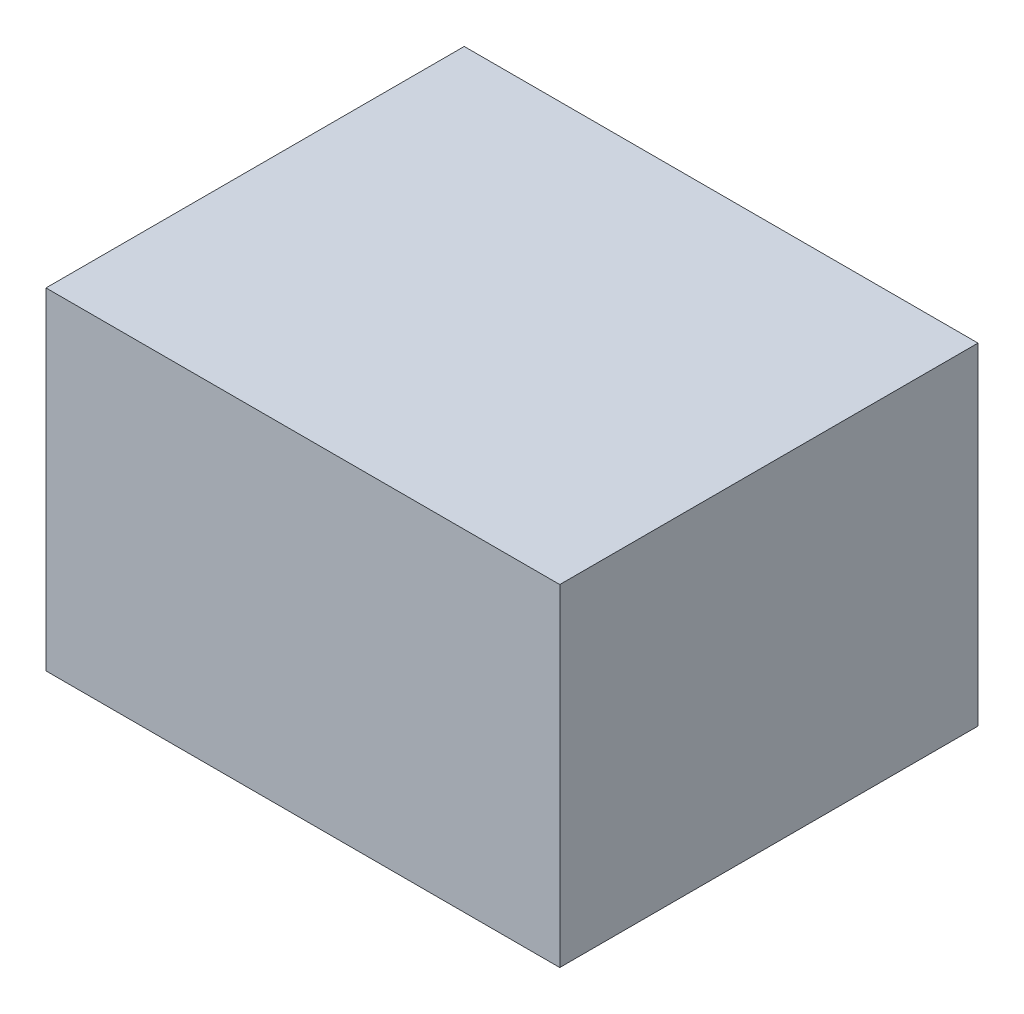
ISO-10303-21;
HEADER;
FILE_DESCRIPTION(('STEP AP214'),'2;1');
FILE_NAME('part.step','',(''),(''),'','','');
FILE_SCHEMA(('AUTOMOTIVE_DESIGN { 1 0 10303 214 1 1 1 1 }'));
ENDSEC;
DATA;
#1=APPLICATION_CONTEXT('core data for automotive mechanical design processes');
#2=APPLICATION_PROTOCOL_DEFINITION('international standard','automotive_design',2000,#1);
#3=PRODUCT_CONTEXT('',#1,'mechanical');
#4=PRODUCT('Part','Part','',(#3));
#5=PRODUCT_RELATED_PRODUCT_CATEGORY('part','',(#4));
#6=PRODUCT_DEFINITION_FORMATION('','',#4);
#7=PRODUCT_DEFINITION_CONTEXT('part definition',#1,'design');
#8=PRODUCT_DEFINITION('design','',#6,#7);
#9=PRODUCT_DEFINITION_SHAPE('','',#8);
#10=(LENGTH_UNIT() NAMED_UNIT(*) SI_UNIT(.MILLI.,.METRE.));
#11=(NAMED_UNIT(*) PLANE_ANGLE_UNIT() SI_UNIT($,.RADIAN.));
#12=(NAMED_UNIT(*) SI_UNIT($,.STERADIAN.) SOLID_ANGLE_UNIT());
#13=UNCERTAINTY_MEASURE_WITH_UNIT(LENGTH_MEASURE(1.E-05),#10,'distance_accuracy_value','');
#14=(GEOMETRIC_REPRESENTATION_CONTEXT(3) GLOBAL_UNCERTAINTY_ASSIGNED_CONTEXT((#13)) GLOBAL_UNIT_ASSIGNED_CONTEXT((#10,
#11,#12)) REPRESENTATION_CONTEXT('',''));
#15=CARTESIAN_POINT('',(0.,0.,0.));
#16=DIRECTION('',(0.,0.,1.));
#17=DIRECTION('',(1.,0.,0.));
#18=AXIS2_PLACEMENT_3D('',#15,#16,#17);
#19=CARTESIAN_POINT('',(-35.625,46.,29.));
#20=DIRECTION('',(1.,0.,0.));
#21=DIRECTION('',(0.,0.,-1.));
#22=AXIS2_PLACEMENT_3D('',#19,#20,#21);
#23=PLANE('',#22);
#24=DIRECTION('',(0.,0.,1.));
#25=VECTOR('',#24,1.);
#26=CARTESIAN_POINT('',(-35.625,0.,29.));
#27=LINE('',#26,#25);
#28=CARTESIAN_POINT('',(-35.625,0.,-29.));
#29=VERTEX_POINT('',#28);
#30=CARTESIAN_POINT('',(-35.625,0.,29.));
#31=VERTEX_POINT('',#30);
#32=EDGE_CURVE('E111',#29,#31,#27,.T.);
#33=ORIENTED_EDGE('',*,*,#32,.T.);
#34=DIRECTION('',(0.,-1.,0.));
#35=VECTOR('',#34,1.);
#36=CARTESIAN_POINT('',(-35.625,46.,29.));
#37=LINE('',#36,#35);
#38=CARTESIAN_POINT('',(-35.625,46.,29.));
#39=VERTEX_POINT('',#38);
#40=EDGE_CURVE('E11',#39,#31,#37,.T.);
#41=ORIENTED_EDGE('',*,*,#40,.F.);
#42=DIRECTION('',(0.,0.,1.));
#43=VECTOR('',#42,1.);
#44=CARTESIAN_POINT('',(-35.625,46.,29.));
#45=LINE('',#44,#43);
#46=CARTESIAN_POINT('',(-35.625,46.,-29.));
#47=VERTEX_POINT('',#46);
#48=EDGE_CURVE('E95',#47,#39,#45,.T.);
#49=ORIENTED_EDGE('',*,*,#48,.F.);
#50=DIRECTION('',(0.,-1.,0.));
#51=VECTOR('',#50,1.);
#52=CARTESIAN_POINT('',(-35.625,46.,-29.));
#53=LINE('',#52,#51);
#54=EDGE_CURVE('E107',#47,#29,#53,.T.);
#55=ORIENTED_EDGE('',*,*,#54,.T.);
#56=EDGE_LOOP('',(#33,#41,#49,#55));
#57=FACE_BOUND('',#56,.T.);
#58=ADVANCED_FACE('F43',(#57),#23,.F.);
#59=CARTESIAN_POINT('',(35.625,46.,29.));
#60=DIRECTION('',(0.,0.,-1.));
#61=DIRECTION('',(-1.,0.,0.));
#62=AXIS2_PLACEMENT_3D('',#59,#60,#61);
#63=PLANE('',#62);
#64=DIRECTION('',(1.,0.,0.));
#65=VECTOR('',#64,1.);
#66=CARTESIAN_POINT('',(35.625,0.,29.));
#67=LINE('',#66,#65);
#68=CARTESIAN_POINT('',(35.625,0.,29.));
#69=VERTEX_POINT('',#68);
#70=EDGE_CURVE('E100',#31,#69,#67,.T.);
#71=ORIENTED_EDGE('',*,*,#70,.T.);
#72=DIRECTION('',(0.,-1.,0.));
#73=VECTOR('',#72,1.);
#74=CARTESIAN_POINT('',(35.625,46.,29.));
#75=LINE('',#74,#73);
#76=CARTESIAN_POINT('',(35.625,46.,29.));
#77=VERTEX_POINT('',#76);
#78=EDGE_CURVE('E52',#77,#69,#75,.T.);
#79=ORIENTED_EDGE('',*,*,#78,.F.);
#80=DIRECTION('',(1.,0.,0.));
#81=VECTOR('',#80,1.);
#82=CARTESIAN_POINT('',(35.625,46.,29.));
#83=LINE('',#82,#81);
#84=EDGE_CURVE('E90',#39,#77,#83,.T.);
#85=ORIENTED_EDGE('',*,*,#84,.F.);
#86=ORIENTED_EDGE('',*,*,#40,.T.);
#87=EDGE_LOOP('',(#71,#79,#85,#86));
#88=FACE_BOUND('',#87,.T.);
#89=ADVANCED_FACE('F99',(#88),#63,.F.);
#90=CARTESIAN_POINT('',(35.625,46.,29.));
#91=DIRECTION('',(-1.,0.,0.));
#92=DIRECTION('',(0.,0.,1.));
#93=AXIS2_PLACEMENT_3D('',#90,#91,#92);
#94=PLANE('',#93);
#95=DIRECTION('',(0.,0.,-1.));
#96=VECTOR('',#95,1.);
#97=CARTESIAN_POINT('',(35.625,0.,29.));
#98=LINE('',#97,#96);
#99=CARTESIAN_POINT('',(35.625,0.,-29.));
#100=VERTEX_POINT('',#99);
#101=EDGE_CURVE('E77',#69,#100,#98,.T.);
#102=ORIENTED_EDGE('',*,*,#101,.T.);
#103=DIRECTION('',(0.,-1.,0.));
#104=VECTOR('',#103,1.);
#105=CARTESIAN_POINT('',(35.625,46.,-29.));
#106=LINE('',#105,#104);
#107=CARTESIAN_POINT('',(35.625,46.,-29.));
#108=VERTEX_POINT('',#107);
#109=EDGE_CURVE('E102',#108,#100,#106,.T.);
#110=ORIENTED_EDGE('',*,*,#109,.F.);
#111=DIRECTION('',(0.,0.,-1.));
#112=VECTOR('',#111,1.);
#113=CARTESIAN_POINT('',(35.625,46.,29.));
#114=LINE('',#113,#112);
#115=EDGE_CURVE('E93',#77,#108,#114,.T.);
#116=ORIENTED_EDGE('',*,*,#115,.F.);
#117=ORIENTED_EDGE('',*,*,#78,.T.);
#118=EDGE_LOOP('',(#102,#110,#116,#117));
#119=FACE_BOUND('',#118,.T.);
#120=ADVANCED_FACE('F103',(#119),#94,.F.);
#121=CARTESIAN_POINT('',(35.625,46.,-29.));
#122=DIRECTION('',(0.,0.,1.));
#123=DIRECTION('',(1.,0.,0.));
#124=AXIS2_PLACEMENT_3D('',#121,#122,#123);
#125=PLANE('',#124);
#126=DIRECTION('',(-1.,0.,0.));
#127=VECTOR('',#126,1.);
#128=CARTESIAN_POINT('',(35.625,0.,-29.));
#129=LINE('',#128,#127);
#130=EDGE_CURVE('E83',#100,#29,#129,.T.);
#131=ORIENTED_EDGE('',*,*,#130,.T.);
#132=ORIENTED_EDGE('',*,*,#54,.F.);
#133=DIRECTION('',(-1.,0.,0.));
#134=VECTOR('',#133,1.);
#135=CARTESIAN_POINT('',(35.625,46.,-29.));
#136=LINE('',#135,#134);
#137=EDGE_CURVE('E60',#108,#47,#136,.T.);
#138=ORIENTED_EDGE('',*,*,#137,.F.);
#139=ORIENTED_EDGE('',*,*,#109,.T.);
#140=EDGE_LOOP('',(#131,#132,#138,#139));
#141=FACE_BOUND('',#140,.T.);
#142=ADVANCED_FACE('F124',(#141),#125,.F.);
#143=CARTESIAN_POINT('',(0.,46.,0.));
#144=DIRECTION('',(0.,1.,0.));
#145=DIRECTION('',(0.,0.,1.));
#146=AXIS2_PLACEMENT_3D('',#143,#144,#145);
#147=PLANE('',#146);
#148=ORIENTED_EDGE('',*,*,#48,.T.);
#149=ORIENTED_EDGE('',*,*,#84,.T.);
#150=ORIENTED_EDGE('',*,*,#115,.T.);
#151=ORIENTED_EDGE('',*,*,#137,.T.);
#152=EDGE_LOOP('',(#148,#149,#150,#151));
#153=FACE_BOUND('',#152,.T.);
#154=ADVANCED_FACE('F91',(#153),#147,.T.);
#155=CARTESIAN_POINT('',(0.,0.,0.));
#156=DIRECTION('',(0.,1.,0.));
#157=DIRECTION('',(0.,0.,1.));
#158=AXIS2_PLACEMENT_3D('',#155,#156,#157);
#159=PLANE('',#158);
#160=ORIENTED_EDGE('',*,*,#32,.F.);
#161=ORIENTED_EDGE('',*,*,#130,.F.);
#162=ORIENTED_EDGE('',*,*,#101,.F.);
#163=ORIENTED_EDGE('',*,*,#70,.F.);
#164=EDGE_LOOP('',(#160,#161,#162,#163));
#165=FACE_BOUND('',#164,.T.);
#166=ADVANCED_FACE('F127',(#165),#159,.F.);
#167=CLOSED_SHELL('',(#58,#89,#120,#142,#154,#166));
#168=MANIFOLD_SOLID_BREP('B2',#167);
#169=ADVANCED_BREP_SHAPE_REPRESENTATION('',(#18,#168),#14);
#170=SHAPE_DEFINITION_REPRESENTATION(#9,#169);
ENDSEC;
END-ISO-10303-21;
